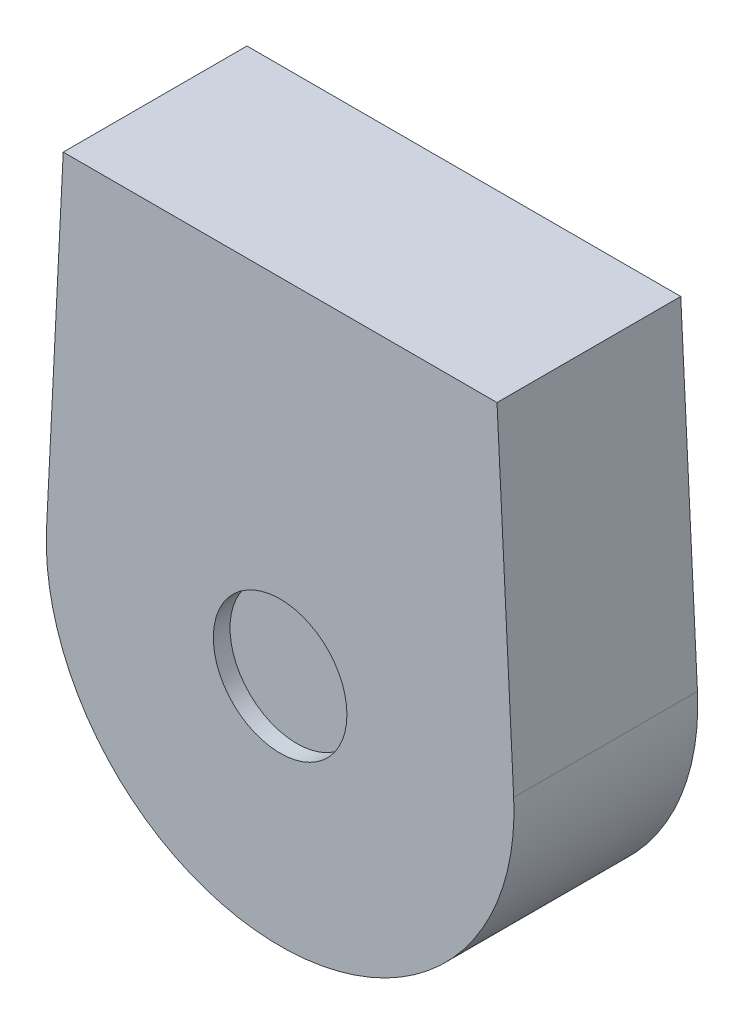
ISO-10303-21;
HEADER;
FILE_DESCRIPTION(('STEP AP214'),'2;1');
FILE_NAME('part.step','',(''),(''),'','','');
FILE_SCHEMA(('AUTOMOTIVE_DESIGN { 1 0 10303 214 1 1 1 1 }'));
ENDSEC;
DATA;
#1=APPLICATION_CONTEXT('core data for automotive mechanical design processes');
#2=APPLICATION_PROTOCOL_DEFINITION('international standard','automotive_design',2000,#1);
#3=PRODUCT_CONTEXT('',#1,'mechanical');
#4=PRODUCT('Part','Part','',(#3));
#5=PRODUCT_RELATED_PRODUCT_CATEGORY('part','',(#4));
#6=PRODUCT_DEFINITION_FORMATION('','',#4);
#7=PRODUCT_DEFINITION_CONTEXT('part definition',#1,'design');
#8=PRODUCT_DEFINITION('design','',#6,#7);
#9=PRODUCT_DEFINITION_SHAPE('','',#8);
#10=(LENGTH_UNIT() NAMED_UNIT(*) SI_UNIT(.MILLI.,.METRE.));
#11=(NAMED_UNIT(*) PLANE_ANGLE_UNIT() SI_UNIT($,.RADIAN.));
#12=(NAMED_UNIT(*) SI_UNIT($,.STERADIAN.) SOLID_ANGLE_UNIT());
#13=UNCERTAINTY_MEASURE_WITH_UNIT(LENGTH_MEASURE(1.E-05),#10,'distance_accuracy_value','');
#14=(GEOMETRIC_REPRESENTATION_CONTEXT(3) GLOBAL_UNCERTAINTY_ASSIGNED_CONTEXT((#13)) GLOBAL_UNIT_ASSIGNED_CONTEXT((#10,
#11,#12)) REPRESENTATION_CONTEXT('',''));
#15=CARTESIAN_POINT('',(0.,0.,0.));
#16=DIRECTION('',(0.,0.,1.));
#17=DIRECTION('',(1.,0.,0.));
#18=AXIS2_PLACEMENT_3D('',#15,#16,#17);
#19=CARTESIAN_POINT('',(-32.9788022297464,52.5124004735193,-13.97));
#20=DIRECTION('',(0.,1.,0.));
#21=DIRECTION('',(0.,0.,1.));
#22=AXIS2_PLACEMENT_3D('',#19,#20,#21);
#23=PLANE('',#22);
#24=DIRECTION('',(0.,0.,1.));
#25=VECTOR('',#24,1.);
#26=CARTESIAN_POINT('',(-32.9788022297464,52.5124004735193,-13.97));
#27=LINE('',#26,#25);
#28=CARTESIAN_POINT('',(-32.9788022297464,52.5124004735193,-13.97));
#29=VERTEX_POINT('',#28);
#30=CARTESIAN_POINT('',(-32.9788022297464,52.5124004735193,13.97));
#31=VERTEX_POINT('',#30);
#32=EDGE_CURVE('E44',#29,#31,#27,.T.);
#33=ORIENTED_EDGE('',*,*,#32,.T.);
#34=DIRECTION('',(-1.,0.,0.));
#35=VECTOR('',#34,1.);
#36=CARTESIAN_POINT('',(-32.9788022297464,52.5124004735193,13.97));
#37=LINE('',#36,#35);
#38=CARTESIAN_POINT('',(32.9788022297464,52.5124004735193,13.97));
#39=VERTEX_POINT('',#38);
#40=EDGE_CURVE('E148',#39,#31,#37,.T.);
#41=ORIENTED_EDGE('',*,*,#40,.F.);
#42=DIRECTION('',(0.,0.,1.));
#43=VECTOR('',#42,1.);
#44=CARTESIAN_POINT('',(32.9788022297464,52.5124004735193,-13.97));
#45=LINE('',#44,#43);
#46=CARTESIAN_POINT('',(32.9788022297464,52.5124004735193,-13.97));
#47=VERTEX_POINT('',#46);
#48=EDGE_CURVE('E11',#47,#39,#45,.T.);
#49=ORIENTED_EDGE('',*,*,#48,.F.);
#50=DIRECTION('',(-1.,0.,0.));
#51=VECTOR('',#50,1.);
#52=CARTESIAN_POINT('',(-32.9788022297464,52.5124004735193,-13.97));
#53=LINE('',#52,#51);
#54=EDGE_CURVE('E162',#47,#29,#53,.T.);
#55=ORIENTED_EDGE('',*,*,#54,.T.);
#56=EDGE_LOOP('',(#33,#41,#49,#55));
#57=FACE_BOUND('',#56,.T.);
#58=ADVANCED_FACE('F41',(#57),#23,.T.);
#59=CARTESIAN_POINT('',(32.9788022297464,52.5124004735193,-13.97));
#60=DIRECTION('',(0.998752338877845,0.0499376169438917,0.));
#61=DIRECTION('',(-0.0499376169438917,0.998752338877845,0.));
#62=AXIS2_PLACEMENT_3D('',#59,#60,#61);
#63=PLANE('',#62);
#64=ORIENTED_EDGE('',*,*,#48,.T.);
#65=DIRECTION('',(-0.0499376169438917,0.998752338877845,0.));
#66=VECTOR('',#65,1.);
#67=CARTESIAN_POINT('',(32.9788022297464,52.5124004735193,13.97));
#68=LINE('',#67,#66);
#69=CARTESIAN_POINT('',(35.5156331704961,1.77578165852481,13.97));
#70=VERTEX_POINT('',#69);
#71=EDGE_CURVE('E159',#70,#39,#68,.T.);
#72=ORIENTED_EDGE('',*,*,#71,.F.);
#73=DIRECTION('',(0.,0.,1.));
#74=VECTOR('',#73,1.);
#75=CARTESIAN_POINT('',(35.5156331704961,1.77578165852481,-13.97));
#76=LINE('',#75,#74);
#77=CARTESIAN_POINT('',(35.5156331704961,1.77578165852481,-13.97));
#78=VERTEX_POINT('',#77);
#79=EDGE_CURVE('E49',#78,#70,#76,.T.);
#80=ORIENTED_EDGE('',*,*,#79,.F.);
#81=DIRECTION('',(-0.0499376169438917,0.998752338877845,0.));
#82=VECTOR('',#81,1.);
#83=CARTESIAN_POINT('',(32.9788022297464,52.5124004735193,-13.97));
#84=LINE('',#83,#82);
#85=EDGE_CURVE('E170',#78,#47,#84,.T.);
#86=ORIENTED_EDGE('',*,*,#85,.T.);
#87=EDGE_LOOP('',(#64,#72,#80,#86));
#88=FACE_BOUND('',#87,.T.);
#89=ADVANCED_FACE('F183',(#88),#63,.T.);
#90=CARTESIAN_POINT('',(0.,0.,-13.97));
#91=DIRECTION('',(0.,0.,1.));
#92=DIRECTION('',(1.,0.,0.));
#93=AXIS2_PLACEMENT_3D('',#90,#91,#92);
#94=CYLINDRICAL_SURFACE('',#93,35.56);
#95=ORIENTED_EDGE('',*,*,#79,.T.);
#96=CARTESIAN_POINT('',(0.,0.,13.97));
#97=DIRECTION('',(0.,0.,1.));
#98=DIRECTION('',(1.,0.,0.));
#99=AXIS2_PLACEMENT_3D('',#96,#97,#98);
#100=CIRCLE('',#99,35.56);
#101=CARTESIAN_POINT('',(-35.5156331704961,1.7757816585248,13.97));
#102=VERTEX_POINT('',#101);
#103=EDGE_CURVE('E156',#102,#70,#100,.T.);
#104=ORIENTED_EDGE('',*,*,#103,.F.);
#105=DIRECTION('',(0.,0.,1.));
#106=VECTOR('',#105,1.);
#107=CARTESIAN_POINT('',(-35.5156331704961,1.7757816585248,-13.97));
#108=LINE('',#107,#106);
#109=CARTESIAN_POINT('',(-35.5156331704961,1.7757816585248,-13.97));
#110=VERTEX_POINT('',#109);
#111=EDGE_CURVE('E173',#110,#102,#108,.T.);
#112=ORIENTED_EDGE('',*,*,#111,.F.);
#113=CARTESIAN_POINT('',(0.,0.,-13.97));
#114=DIRECTION('',(0.,0.,1.));
#115=DIRECTION('',(1.,0.,0.));
#116=AXIS2_PLACEMENT_3D('',#113,#114,#115);
#117=CIRCLE('',#116,35.56);
#118=EDGE_CURVE('E167',#110,#78,#117,.T.);
#119=ORIENTED_EDGE('',*,*,#118,.T.);
#120=EDGE_LOOP('',(#95,#104,#112,#119));
#121=FACE_BOUND('',#120,.T.);
#122=ADVANCED_FACE('F189',(#121),#94,.T.);
#123=CARTESIAN_POINT('',(-35.5156331704961,1.77578165852481,-13.97));
#124=DIRECTION('',(-0.998752338877845,0.0499376169438917,0.));
#125=DIRECTION('',(-0.0499376169438917,-0.998752338877845,0.));
#126=AXIS2_PLACEMENT_3D('',#123,#124,#125);
#127=PLANE('',#126);
#128=ORIENTED_EDGE('',*,*,#111,.T.);
#129=DIRECTION('',(-0.0499376169438917,-0.998752338877845,0.));
#130=VECTOR('',#129,1.);
#131=CARTESIAN_POINT('',(-35.5156331704961,1.77578165852481,13.97));
#132=LINE('',#131,#130);
#133=EDGE_CURVE('E153',#31,#102,#132,.T.);
#134=ORIENTED_EDGE('',*,*,#133,.F.);
#135=ORIENTED_EDGE('',*,*,#32,.F.);
#136=DIRECTION('',(-0.0499376169438917,-0.998752338877845,0.));
#137=VECTOR('',#136,1.);
#138=CARTESIAN_POINT('',(-35.5156331704961,1.77578165852481,-13.97));
#139=LINE('',#138,#137);
#140=EDGE_CURVE('E164',#29,#110,#139,.T.);
#141=ORIENTED_EDGE('',*,*,#140,.T.);
#142=EDGE_LOOP('',(#128,#134,#135,#141));
#143=FACE_BOUND('',#142,.T.);
#144=ADVANCED_FACE('F177',(#143),#127,.T.);
#145=CARTESIAN_POINT('',(0.,0.,-13.97));
#146=DIRECTION('',(0.,0.,1.));
#147=DIRECTION('',(1.,0.,0.));
#148=AXIS2_PLACEMENT_3D('',#145,#146,#147);
#149=PLANE('',#148);
#150=DIRECTION('',(1.,0.,0.));
#151=VECTOR('',#150,1.);
#152=CARTESIAN_POINT('',(-18.4456215322418,4.73128160078661,-13.97));
#153=LINE('',#152,#151);
#154=CARTESIAN_POINT('',(-18.4456215322418,4.73128160078661,-13.97));
#155=VERTEX_POINT('',#154);
#156=CARTESIAN_POINT('',(-10.7250436992861,4.73128160078661,-13.97));
#157=VERTEX_POINT('',#156);
#158=EDGE_CURVE('E135',#155,#157,#153,.T.);
#159=ORIENTED_EDGE('',*,*,#158,.F.);
#160=DIRECTION('',(0.,1.,0.));
#161=VECTOR('',#160,1.);
#162=CARTESIAN_POINT('',(-18.4456215322418,-6.96011860918992,-13.97));
#163=LINE('',#162,#161);
#164=CARTESIAN_POINT('',(-18.4456215322418,-6.96011860918992,-13.97));
#165=VERTEX_POINT('',#164);
#166=EDGE_CURVE('E57',#165,#155,#163,.T.);
#167=ORIENTED_EDGE('',*,*,#166,.F.);
#168=DIRECTION('',(-1.,0.,0.));
#169=VECTOR('',#168,1.);
#170=CARTESIAN_POINT('',(-18.4456215322418,-6.96011860918992,-13.97));
#171=LINE('',#170,#169);
#172=CARTESIAN_POINT('',(-10.7250436992861,-6.96011860918992,-13.97));
#173=VERTEX_POINT('',#172);
#174=EDGE_CURVE('E126',#173,#165,#171,.T.);
#175=ORIENTED_EDGE('',*,*,#174,.F.);
#176=DIRECTION('',(0.,-1.,0.));
#177=VECTOR('',#176,1.);
#178=CARTESIAN_POINT('',(-10.7250436992861,-6.96011860918992,-13.97));
#179=LINE('',#178,#177);
#180=EDGE_CURVE('E129',#157,#173,#179,.T.);
#181=ORIENTED_EDGE('',*,*,#180,.F.);
#182=EDGE_LOOP('',(#159,#167,#175,#181));
#183=FACE_BOUND('',#182,.T.);
#184=ORIENTED_EDGE('',*,*,#54,.F.);
#185=ORIENTED_EDGE('',*,*,#85,.F.);
#186=ORIENTED_EDGE('',*,*,#118,.F.);
#187=ORIENTED_EDGE('',*,*,#140,.F.);
#188=EDGE_LOOP('',(#184,#185,#186,#187));
#189=FACE_BOUND('',#188,.T.);
#190=ADVANCED_FACE('F187',(#183,#189),#149,.F.);
#191=CARTESIAN_POINT('',(0.,0.,13.97));
#192=DIRECTION('',(0.,0.,1.));
#193=DIRECTION('',(1.,0.,0.));
#194=AXIS2_PLACEMENT_3D('',#191,#192,#193);
#195=PLANE('',#194);
#196=CARTESIAN_POINT('',(0.,-1.33025439009923E-13,13.97));
#197=DIRECTION('',(0.,0.,1.));
#198=DIRECTION('',(1.,0.,0.));
#199=AXIS2_PLACEMENT_3D('',#196,#197,#198);
#200=CIRCLE('',#199,10.16);
#201=CARTESIAN_POINT('',(10.16,-1.33025439009923E-13,13.97));
#202=VERTEX_POINT('',#201);
#203=EDGE_CURVE('E141',#202,#202,#200,.T.);
#204=ORIENTED_EDGE('',*,*,#203,.F.);
#205=EDGE_LOOP('',(#204));
#206=FACE_BOUND('',#205,.T.);
#207=ORIENTED_EDGE('',*,*,#40,.T.);
#208=ORIENTED_EDGE('',*,*,#133,.T.);
#209=ORIENTED_EDGE('',*,*,#103,.T.);
#210=ORIENTED_EDGE('',*,*,#71,.T.);
#211=EDGE_LOOP('',(#207,#208,#209,#210));
#212=FACE_BOUND('',#211,.T.);
#213=ADVANCED_FACE('F180',(#206,#212),#195,.T.);
#214=CARTESIAN_POINT('',(0.,-1.33025439009923E-13,11.43));
#215=DIRECTION('',(0.,0.,1.));
#216=DIRECTION('',(1.,0.,0.));
#217=AXIS2_PLACEMENT_3D('',#214,#215,#216);
#218=CYLINDRICAL_SURFACE('',#217,10.16);
#219=CARTESIAN_POINT('',(0.,-1.33025439009923E-13,11.43));
#220=DIRECTION('',(0.,0.,1.));
#221=DIRECTION('',(1.,0.,0.));
#222=AXIS2_PLACEMENT_3D('',#219,#220,#221);
#223=CIRCLE('',#222,10.16);
#224=CARTESIAN_POINT('',(10.16,-1.33025439009923E-13,11.43));
#225=VERTEX_POINT('',#224);
#226=EDGE_CURVE('E145',#225,#225,#223,.T.);
#227=ORIENTED_EDGE('',*,*,#226,.F.);
#228=EDGE_LOOP('',(#227));
#229=FACE_BOUND('',#228,.T.);
#230=ORIENTED_EDGE('',*,*,#203,.T.);
#231=EDGE_LOOP('',(#230));
#232=FACE_BOUND('',#231,.T.);
#233=ADVANCED_FACE('F239',(#229,#232),#218,.F.);
#234=CARTESIAN_POINT('',(0.,-1.33025439009923E-13,11.43));
#235=DIRECTION('',(0.,0.,1.));
#236=DIRECTION('',(1.,0.,0.));
#237=AXIS2_PLACEMENT_3D('',#234,#235,#236);
#238=PLANE('',#237);
#239=ORIENTED_EDGE('',*,*,#226,.T.);
#240=EDGE_LOOP('',(#239));
#241=FACE_BOUND('',#240,.T.);
#242=ADVANCED_FACE('F252',(#241),#238,.T.);
#243=CARTESIAN_POINT('',(-18.4456215322418,-6.96011860918992,8.12799999999999));
#244=DIRECTION('',(-1.,0.,0.));
#245=DIRECTION('',(0.,0.,1.));
#246=AXIS2_PLACEMENT_3D('',#243,#244,#245);
#247=PLANE('',#246);
#248=ORIENTED_EDGE('',*,*,#166,.T.);
#249=DIRECTION('',(0.,0.,-1.));
#250=VECTOR('',#249,1.);
#251=CARTESIAN_POINT('',(-18.4456215322418,4.73128160078661,8.12799999999999));
#252=LINE('',#251,#250);
#253=CARTESIAN_POINT('',(-18.4456215322418,4.73128160078661,8.12799999999999));
#254=VERTEX_POINT('',#253);
#255=EDGE_CURVE('E104',#254,#155,#252,.T.);
#256=ORIENTED_EDGE('',*,*,#255,.F.);
#257=DIRECTION('',(0.,1.,0.));
#258=VECTOR('',#257,1.);
#259=CARTESIAN_POINT('',(-18.4456215322418,-6.96011860918992,8.12799999999999));
#260=LINE('',#259,#258);
#261=CARTESIAN_POINT('',(-18.4456215322418,-6.96011860918992,8.12799999999999));
#262=VERTEX_POINT('',#261);
#263=EDGE_CURVE('E108',#262,#254,#260,.T.);
#264=ORIENTED_EDGE('',*,*,#263,.F.);
#265=DIRECTION('',(0.,0.,-1.));
#266=VECTOR('',#265,1.);
#267=CARTESIAN_POINT('',(-18.4456215322418,-6.96011860918992,8.12799999999999));
#268=LINE('',#267,#266);
#269=EDGE_CURVE('E139',#262,#165,#268,.T.);
#270=ORIENTED_EDGE('',*,*,#269,.T.);
#271=EDGE_LOOP('',(#248,#256,#264,#270));
#272=FACE_BOUND('',#271,.T.);
#273=ADVANCED_FACE('F106',(#272),#247,.F.);
#274=CARTESIAN_POINT('',(-18.4456215322418,-6.96011860918992,8.12799999999999));
#275=DIRECTION('',(0.,-1.,0.));
#276=DIRECTION('',(1.,0.,0.));
#277=AXIS2_PLACEMENT_3D('',#274,#275,#276);
#278=PLANE('',#277);
#279=ORIENTED_EDGE('',*,*,#174,.T.);
#280=ORIENTED_EDGE('',*,*,#269,.F.);
#281=DIRECTION('',(-1.,0.,0.));
#282=VECTOR('',#281,1.);
#283=CARTESIAN_POINT('',(-18.4456215322418,-6.96011860918992,8.12799999999999));
#284=LINE('',#283,#282);
#285=CARTESIAN_POINT('',(-10.7250436992861,-6.96011860918992,8.12799999999999));
#286=VERTEX_POINT('',#285);
#287=EDGE_CURVE('E114',#286,#262,#284,.T.);
#288=ORIENTED_EDGE('',*,*,#287,.F.);
#289=DIRECTION('',(0.,0.,-1.));
#290=VECTOR('',#289,1.);
#291=CARTESIAN_POINT('',(-10.7250436992861,-6.96011860918992,8.12799999999999));
#292=LINE('',#291,#290);
#293=EDGE_CURVE('E142',#286,#173,#292,.T.);
#294=ORIENTED_EDGE('',*,*,#293,.T.);
#295=EDGE_LOOP('',(#279,#280,#288,#294));
#296=FACE_BOUND('',#295,.T.);
#297=ADVANCED_FACE('F269',(#296),#278,.F.);
#298=CARTESIAN_POINT('',(-10.7250436992861,-6.96011860918992,8.12799999999999));
#299=DIRECTION('',(1.,0.,0.));
#300=DIRECTION('',(0.,0.,-1.));
#301=AXIS2_PLACEMENT_3D('',#298,#299,#300);
#302=PLANE('',#301);
#303=ORIENTED_EDGE('',*,*,#180,.T.);
#304=ORIENTED_EDGE('',*,*,#293,.F.);
#305=DIRECTION('',(0.,-1.,0.));
#306=VECTOR('',#305,1.);
#307=CARTESIAN_POINT('',(-10.7250436992861,-6.96011860918992,8.12799999999999));
#308=LINE('',#307,#306);
#309=CARTESIAN_POINT('',(-10.7250436992861,4.73128160078661,8.12799999999999));
#310=VERTEX_POINT('',#309);
#311=EDGE_CURVE('E122',#310,#286,#308,.T.);
#312=ORIENTED_EDGE('',*,*,#311,.F.);
#313=DIRECTION('',(0.,0.,-1.));
#314=VECTOR('',#313,1.);
#315=CARTESIAN_POINT('',(-10.7250436992861,4.73128160078661,8.12799999999999));
#316=LINE('',#315,#314);
#317=EDGE_CURVE('E113',#310,#157,#316,.T.);
#318=ORIENTED_EDGE('',*,*,#317,.T.);
#319=EDGE_LOOP('',(#303,#304,#312,#318));
#320=FACE_BOUND('',#319,.T.);
#321=ADVANCED_FACE('F278',(#320),#302,.F.);
#322=CARTESIAN_POINT('',(-18.4456215322418,4.73128160078661,8.12799999999999));
#323=DIRECTION('',(0.,1.,0.));
#324=DIRECTION('',(0.,0.,1.));
#325=AXIS2_PLACEMENT_3D('',#322,#323,#324);
#326=PLANE('',#325);
#327=ORIENTED_EDGE('',*,*,#158,.T.);
#328=ORIENTED_EDGE('',*,*,#317,.F.);
#329=DIRECTION('',(1.,0.,0.));
#330=VECTOR('',#329,1.);
#331=CARTESIAN_POINT('',(-18.4456215322418,4.73128160078661,8.12799999999999));
#332=LINE('',#331,#330);
#333=EDGE_CURVE('E117',#254,#310,#332,.T.);
#334=ORIENTED_EDGE('',*,*,#333,.F.);
#335=ORIENTED_EDGE('',*,*,#255,.T.);
#336=EDGE_LOOP('',(#327,#328,#334,#335));
#337=FACE_BOUND('',#336,.T.);
#338=ADVANCED_FACE('F118',(#337),#326,.F.);
#339=CARTESIAN_POINT('',(0.,0.,8.12799999999999));
#340=DIRECTION('',(0.,0.,-1.));
#341=DIRECTION('',(-1.,0.,0.));
#342=AXIS2_PLACEMENT_3D('',#339,#340,#341);
#343=PLANE('',#342);
#344=ORIENTED_EDGE('',*,*,#263,.T.);
#345=ORIENTED_EDGE('',*,*,#333,.T.);
#346=ORIENTED_EDGE('',*,*,#311,.T.);
#347=ORIENTED_EDGE('',*,*,#287,.T.);
#348=EDGE_LOOP('',(#344,#345,#346,#347));
#349=FACE_BOUND('',#348,.T.);
#350=ADVANCED_FACE('F124',(#349),#343,.T.);
#351=CLOSED_SHELL('',(#58,#89,#122,#144,#190,#213,#233,#242,#273,#297,#321,#338,#350));
#352=MANIFOLD_SOLID_BREP('B2',#351);
#353=ADVANCED_BREP_SHAPE_REPRESENTATION('',(#18,#352),#14);
#354=SHAPE_DEFINITION_REPRESENTATION(#9,#353);
ENDSEC;
END-ISO-10303-21;
